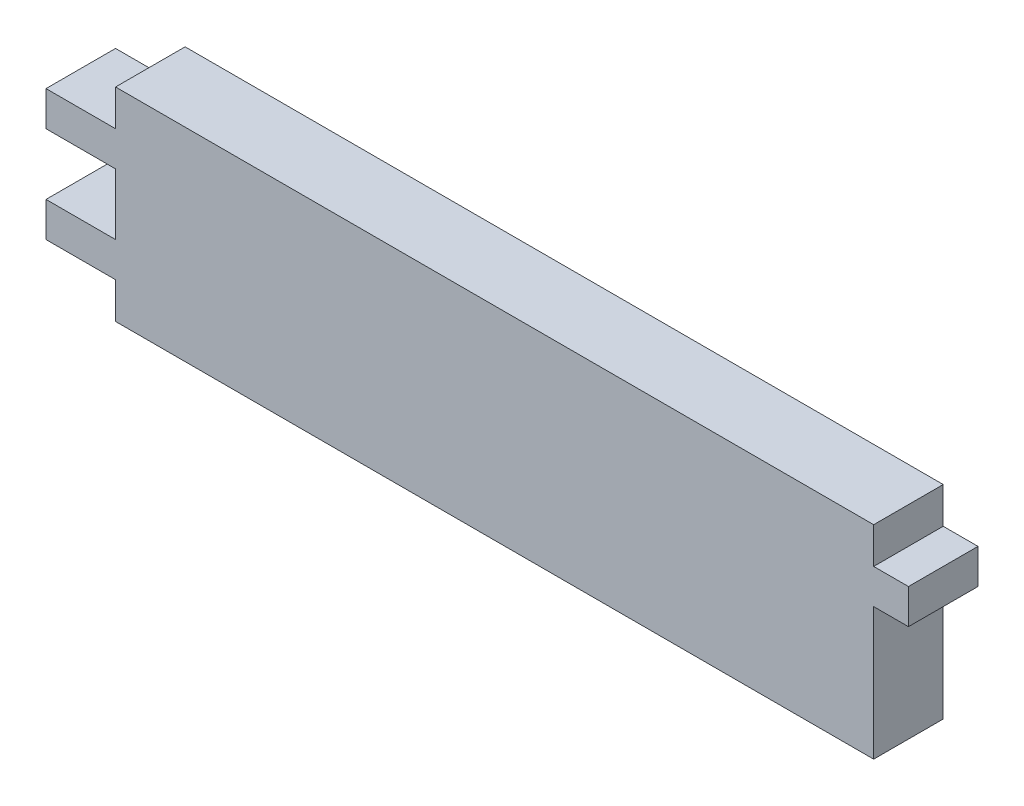
ISO-10303-21;
HEADER;
FILE_DESCRIPTION(('STEP AP214'),'2;1');
FILE_NAME('part.step','',(''),(''),'','','');
FILE_SCHEMA(('AUTOMOTIVE_DESIGN { 1 0 10303 214 1 1 1 1 }'));
ENDSEC;
DATA;
#1=APPLICATION_CONTEXT('core data for automotive mechanical design processes');
#2=APPLICATION_PROTOCOL_DEFINITION('international standard','automotive_design',2000,#1);
#3=PRODUCT_CONTEXT('',#1,'mechanical');
#4=PRODUCT('Part','Part','',(#3));
#5=PRODUCT_RELATED_PRODUCT_CATEGORY('part','',(#4));
#6=PRODUCT_DEFINITION_FORMATION('','',#4);
#7=PRODUCT_DEFINITION_CONTEXT('part definition',#1,'design');
#8=PRODUCT_DEFINITION('design','',#6,#7);
#9=PRODUCT_DEFINITION_SHAPE('','',#8);
#10=(LENGTH_UNIT() NAMED_UNIT(*) SI_UNIT(.MILLI.,.METRE.));
#11=(NAMED_UNIT(*) PLANE_ANGLE_UNIT() SI_UNIT($,.RADIAN.));
#12=(NAMED_UNIT(*) SI_UNIT($,.STERADIAN.) SOLID_ANGLE_UNIT());
#13=UNCERTAINTY_MEASURE_WITH_UNIT(LENGTH_MEASURE(1.E-05),#10,'distance_accuracy_value','');
#14=(GEOMETRIC_REPRESENTATION_CONTEXT(3) GLOBAL_UNCERTAINTY_ASSIGNED_CONTEXT((#13)) GLOBAL_UNIT_ASSIGNED_CONTEXT((#10,
#11,#12)) REPRESENTATION_CONTEXT('',''));
#15=CARTESIAN_POINT('',(0.,0.,0.));
#16=DIRECTION('',(0.,0.,1.));
#17=DIRECTION('',(1.,0.,0.));
#18=AXIS2_PLACEMENT_3D('',#15,#16,#17);
#19=CARTESIAN_POINT('',(-75.8403585971838,8.2416963886862,87.2437164679681));
#20=DIRECTION('',(1.,0.,0.));
#21=DIRECTION('',(0.,0.,-1.));
#22=AXIS2_PLACEMENT_3D('',#19,#20,#21);
#23=PLANE('',#22);
#24=DIRECTION('',(0.,-1.,0.));
#25=VECTOR('',#24,1.);
#26=CARTESIAN_POINT('',(-75.8403585971838,8.2416963886862,6.35000000000004));
#27=LINE('',#26,#25);
#28=CARTESIAN_POINT('',(-75.8403585971838,8.2416963886862,6.35000000000004));
#29=VERTEX_POINT('',#28);
#30=CARTESIAN_POINT('',(-75.8403585971838,5.0666963886862,6.35000000000004));
#31=VERTEX_POINT('',#30);
#32=EDGE_CURVE('E203',#29,#31,#27,.T.);
#33=ORIENTED_EDGE('',*,*,#32,.F.);
#34=DIRECTION('',(0.,0.,-1.));
#35=VECTOR('',#34,1.);
#36=CARTESIAN_POINT('',(-75.8403585971838,8.2416963886862,87.2437164679681));
#37=LINE('',#36,#35);
#38=CARTESIAN_POINT('',(-75.8403585971838,8.2416963886862,0.));
#39=VERTEX_POINT('',#38);
#40=EDGE_CURVE('E36',#29,#39,#37,.T.);
#41=ORIENTED_EDGE('',*,*,#40,.T.);
#42=DIRECTION('',(0.,-1.,0.));
#43=VECTOR('',#42,1.);
#44=CARTESIAN_POINT('',(-75.8403585971838,8.2416963886862,0.));
#45=LINE('',#44,#43);
#46=CARTESIAN_POINT('',(-75.8403585971838,5.0666963886862,0.));
#47=VERTEX_POINT('',#46);
#48=EDGE_CURVE('E211',#39,#47,#45,.T.);
#49=ORIENTED_EDGE('',*,*,#48,.T.);
#50=DIRECTION('',(0.,0.,-1.));
#51=VECTOR('',#50,1.);
#52=CARTESIAN_POINT('',(-75.8403585971838,5.0666963886862,87.2437164679681));
#53=LINE('',#52,#51);
#54=EDGE_CURVE('E119',#31,#47,#53,.T.);
#55=ORIENTED_EDGE('',*,*,#54,.F.);
#56=EDGE_LOOP('',(#33,#41,#49,#55));
#57=FACE_BOUND('',#56,.T.);
#58=ADVANCED_FACE('F32',(#57),#23,.F.);
#59=CARTESIAN_POINT('',(-75.8403585971838,5.0666963886862,87.2437164679681));
#60=DIRECTION('',(0.,1.,0.));
#61=DIRECTION('',(0.,0.,1.));
#62=AXIS2_PLACEMENT_3D('',#59,#60,#61);
#63=PLANE('',#62);
#64=DIRECTION('',(1.,0.,0.));
#65=VECTOR('',#64,1.);
#66=CARTESIAN_POINT('',(-75.8403585971838,5.0666963886862,6.35000000000004));
#67=LINE('',#66,#65);
#68=CARTESIAN_POINT('',(-69.4903585971838,5.0666963886862,6.35000000000004));
#69=VERTEX_POINT('',#68);
#70=EDGE_CURVE('E126',#31,#69,#67,.T.);
#71=ORIENTED_EDGE('',*,*,#70,.F.);
#72=ORIENTED_EDGE('',*,*,#54,.T.);
#73=DIRECTION('',(1.,0.,0.));
#74=VECTOR('',#73,1.);
#75=CARTESIAN_POINT('',(-75.8403585971838,5.0666963886862,0.));
#76=LINE('',#75,#74);
#77=CARTESIAN_POINT('',(-69.4903585971838,5.0666963886862,0.));
#78=VERTEX_POINT('',#77);
#79=EDGE_CURVE('E210',#47,#78,#76,.T.);
#80=ORIENTED_EDGE('',*,*,#79,.T.);
#81=DIRECTION('',(0.,0.,-1.));
#82=VECTOR('',#81,1.);
#83=CARTESIAN_POINT('',(-69.4903585971838,5.0666963886862,87.2437164679681));
#84=LINE('',#83,#82);
#85=EDGE_CURVE('E212',#69,#78,#84,.T.);
#86=ORIENTED_EDGE('',*,*,#85,.F.);
#87=EDGE_LOOP('',(#71,#72,#80,#86));
#88=FACE_BOUND('',#87,.T.);
#89=ADVANCED_FACE('F281',(#88),#63,.F.);
#90=CARTESIAN_POINT('',(-69.4903585971838,5.0666963886862,87.2437164679681));
#91=DIRECTION('',(1.,0.,0.));
#92=DIRECTION('',(0.,0.,-1.));
#93=AXIS2_PLACEMENT_3D('',#90,#91,#92);
#94=PLANE('',#93);
#95=DIRECTION('',(0.,-1.,0.));
#96=VECTOR('',#95,1.);
#97=CARTESIAN_POINT('',(-69.4903585971838,5.0666963886862,6.35000000000004));
#98=LINE('',#97,#96);
#99=CARTESIAN_POINT('',(-69.4903585971838,-0.521303611313801,6.35000000000004));
#100=VERTEX_POINT('',#99);
#101=EDGE_CURVE('E199',#69,#100,#98,.T.);
#102=ORIENTED_EDGE('',*,*,#101,.F.);
#103=ORIENTED_EDGE('',*,*,#85,.T.);
#104=DIRECTION('',(0.,-1.,0.));
#105=VECTOR('',#104,1.);
#106=CARTESIAN_POINT('',(-69.4903585971838,5.0666963886862,0.));
#107=LINE('',#106,#105);
#108=CARTESIAN_POINT('',(-69.4903585971838,-0.521303611313801,0.));
#109=VERTEX_POINT('',#108);
#110=EDGE_CURVE('E214',#78,#109,#107,.T.);
#111=ORIENTED_EDGE('',*,*,#110,.T.);
#112=DIRECTION('',(0.,0.,-1.));
#113=VECTOR('',#112,1.);
#114=CARTESIAN_POINT('',(-69.4903585971838,-0.521303611313801,87.2437164679681));
#115=LINE('',#114,#113);
#116=EDGE_CURVE('E215',#100,#109,#115,.T.);
#117=ORIENTED_EDGE('',*,*,#116,.F.);
#118=EDGE_LOOP('',(#102,#103,#111,#117));
#119=FACE_BOUND('',#118,.T.);
#120=ADVANCED_FACE('F284',(#119),#94,.F.);
#121=CARTESIAN_POINT('',(-69.4903585971838,-0.521303611313801,87.2437164679681));
#122=DIRECTION('',(0.,-1.,0.));
#123=DIRECTION('',(1.,0.,0.));
#124=AXIS2_PLACEMENT_3D('',#121,#122,#123);
#125=PLANE('',#124);
#126=DIRECTION('',(-1.,0.,0.));
#127=VECTOR('',#126,1.);
#128=CARTESIAN_POINT('',(-69.4903585971838,-0.521303611313801,6.35000000000004));
#129=LINE('',#128,#127);
#130=CARTESIAN_POINT('',(-75.8403585971838,-0.521303611313801,6.35000000000004));
#131=VERTEX_POINT('',#130);
#132=EDGE_CURVE('E196',#100,#131,#129,.T.);
#133=ORIENTED_EDGE('',*,*,#132,.F.);
#134=ORIENTED_EDGE('',*,*,#116,.T.);
#135=DIRECTION('',(-1.,0.,0.));
#136=VECTOR('',#135,1.);
#137=CARTESIAN_POINT('',(-69.4903585971838,-0.521303611313801,0.));
#138=LINE('',#137,#136);
#139=CARTESIAN_POINT('',(-75.8403585971838,-0.521303611313801,0.));
#140=VERTEX_POINT('',#139);
#141=EDGE_CURVE('E217',#109,#140,#138,.T.);
#142=ORIENTED_EDGE('',*,*,#141,.T.);
#143=DIRECTION('',(0.,0.,-1.));
#144=VECTOR('',#143,1.);
#145=CARTESIAN_POINT('',(-75.8403585971838,-0.521303611313801,87.2437164679681));
#146=LINE('',#145,#144);
#147=EDGE_CURVE('E218',#131,#140,#146,.T.);
#148=ORIENTED_EDGE('',*,*,#147,.F.);
#149=EDGE_LOOP('',(#133,#134,#142,#148));
#150=FACE_BOUND('',#149,.T.);
#151=ADVANCED_FACE('F286',(#150),#125,.F.);
#152=CARTESIAN_POINT('',(-75.8403585971838,-0.521303611313801,87.2437164679681));
#153=DIRECTION('',(1.,0.,0.));
#154=DIRECTION('',(0.,0.,-1.));
#155=AXIS2_PLACEMENT_3D('',#152,#153,#154);
#156=PLANE('',#155);
#157=DIRECTION('',(0.,-1.,0.));
#158=VECTOR('',#157,1.);
#159=CARTESIAN_POINT('',(-75.8403585971838,-0.521303611313801,6.35000000000004));
#160=LINE('',#159,#158);
#161=CARTESIAN_POINT('',(-75.8403585971838,-3.6963036113138,6.35000000000004));
#162=VERTEX_POINT('',#161);
#163=EDGE_CURVE('E193',#131,#162,#160,.T.);
#164=ORIENTED_EDGE('',*,*,#163,.F.);
#165=ORIENTED_EDGE('',*,*,#147,.T.);
#166=DIRECTION('',(0.,-1.,0.));
#167=VECTOR('',#166,1.);
#168=CARTESIAN_POINT('',(-75.8403585971838,-0.521303611313801,0.));
#169=LINE('',#168,#167);
#170=CARTESIAN_POINT('',(-75.8403585971838,-3.6963036113138,0.));
#171=VERTEX_POINT('',#170);
#172=EDGE_CURVE('E220',#140,#171,#169,.T.);
#173=ORIENTED_EDGE('',*,*,#172,.T.);
#174=DIRECTION('',(0.,0.,-1.));
#175=VECTOR('',#174,1.);
#176=CARTESIAN_POINT('',(-75.8403585971838,-3.6963036113138,87.2437164679681));
#177=LINE('',#176,#175);
#178=EDGE_CURVE('E221',#162,#171,#177,.T.);
#179=ORIENTED_EDGE('',*,*,#178,.F.);
#180=EDGE_LOOP('',(#164,#165,#173,#179));
#181=FACE_BOUND('',#180,.T.);
#182=ADVANCED_FACE('F290',(#181),#156,.F.);
#183=CARTESIAN_POINT('',(-75.8403585971838,-3.6963036113138,87.2437164679681));
#184=DIRECTION('',(0.,1.,0.));
#185=DIRECTION('',(-1.,0.,0.));
#186=AXIS2_PLACEMENT_3D('',#183,#184,#185);
#187=PLANE('',#186);
#188=DIRECTION('',(1.,0.,0.));
#189=VECTOR('',#188,1.);
#190=CARTESIAN_POINT('',(-75.8403585971838,-3.6963036113138,6.35000000000004));
#191=LINE('',#190,#189);
#192=CARTESIAN_POINT('',(-69.4903585971838,-3.6963036113138,6.35000000000004));
#193=VERTEX_POINT('',#192);
#194=EDGE_CURVE('E190',#162,#193,#191,.T.);
#195=ORIENTED_EDGE('',*,*,#194,.F.);
#196=ORIENTED_EDGE('',*,*,#178,.T.);
#197=DIRECTION('',(1.,0.,0.));
#198=VECTOR('',#197,1.);
#199=CARTESIAN_POINT('',(-75.8403585971838,-3.6963036113138,0.));
#200=LINE('',#199,#198);
#201=CARTESIAN_POINT('',(-69.4903585971838,-3.6963036113138,0.));
#202=VERTEX_POINT('',#201);
#203=EDGE_CURVE('E223',#171,#202,#200,.T.);
#204=ORIENTED_EDGE('',*,*,#203,.T.);
#205=DIRECTION('',(0.,0.,-1.));
#206=VECTOR('',#205,1.);
#207=CARTESIAN_POINT('',(-69.4903585971838,-3.6963036113138,87.2437164679681));
#208=LINE('',#207,#206);
#209=EDGE_CURVE('E224',#193,#202,#208,.T.);
#210=ORIENTED_EDGE('',*,*,#209,.F.);
#211=EDGE_LOOP('',(#195,#196,#204,#210));
#212=FACE_BOUND('',#211,.T.);
#213=ADVANCED_FACE('F295',(#212),#187,.F.);
#214=CARTESIAN_POINT('',(-69.4903585971838,-6.9983036113138,87.2437164679681));
#215=DIRECTION('',(1.,0.,0.));
#216=DIRECTION('',(0.,0.,-1.));
#217=AXIS2_PLACEMENT_3D('',#214,#215,#216);
#218=PLANE('',#217);
#219=DIRECTION('',(0.,-1.,0.));
#220=VECTOR('',#219,1.);
#221=CARTESIAN_POINT('',(-69.4903585971838,-6.9983036113138,6.35000000000004));
#222=LINE('',#221,#220);
#223=CARTESIAN_POINT('',(-69.4903585971838,-6.9983036113138,6.35000000000004));
#224=VERTEX_POINT('',#223);
#225=EDGE_CURVE('E187',#193,#224,#222,.T.);
#226=ORIENTED_EDGE('',*,*,#225,.F.);
#227=ORIENTED_EDGE('',*,*,#209,.T.);
#228=DIRECTION('',(0.,-1.,0.));
#229=VECTOR('',#228,1.);
#230=CARTESIAN_POINT('',(-69.4903585971838,-6.9983036113138,0.));
#231=LINE('',#230,#229);
#232=CARTESIAN_POINT('',(-69.4903585971838,-6.9983036113138,0.));
#233=VERTEX_POINT('',#232);
#234=EDGE_CURVE('E226',#202,#233,#231,.T.);
#235=ORIENTED_EDGE('',*,*,#234,.T.);
#236=DIRECTION('',(0.,0.,-1.));
#237=VECTOR('',#236,1.);
#238=CARTESIAN_POINT('',(-69.4903585971838,-6.9983036113138,87.2437164679681));
#239=LINE('',#238,#237);
#240=EDGE_CURVE('E227',#224,#233,#239,.T.);
#241=ORIENTED_EDGE('',*,*,#240,.F.);
#242=EDGE_LOOP('',(#226,#227,#235,#241));
#243=FACE_BOUND('',#242,.T.);
#244=ADVANCED_FACE('F298',(#243),#218,.F.);
#245=CARTESIAN_POINT('',(-69.4903585971838,-6.9983036113138,87.2437164679681));
#246=DIRECTION('',(0.,1.,0.));
#247=DIRECTION('',(0.,0.,1.));
#248=AXIS2_PLACEMENT_3D('',#245,#246,#247);
#249=PLANE('',#248);
#250=DIRECTION('',(1.,0.,0.));
#251=VECTOR('',#250,1.);
#252=CARTESIAN_POINT('',(-69.4903585971838,-6.9983036113138,6.35000000000004));
#253=LINE('',#252,#251);
#254=CARTESIAN_POINT('',(-0.27535859718375,-6.9983036113138,6.35000000000004));
#255=VERTEX_POINT('',#254);
#256=EDGE_CURVE('E184',#224,#255,#253,.T.);
#257=ORIENTED_EDGE('',*,*,#256,.F.);
#258=ORIENTED_EDGE('',*,*,#240,.T.);
#259=DIRECTION('',(1.,0.,0.));
#260=VECTOR('',#259,1.);
#261=CARTESIAN_POINT('',(-69.4903585971838,-6.9983036113138,0.));
#262=LINE('',#261,#260);
#263=CARTESIAN_POINT('',(-0.27535859718375,-6.9983036113138,0.));
#264=VERTEX_POINT('',#263);
#265=EDGE_CURVE('E229',#233,#264,#262,.T.);
#266=ORIENTED_EDGE('',*,*,#265,.T.);
#267=DIRECTION('',(0.,0.,-1.));
#268=VECTOR('',#267,1.);
#269=CARTESIAN_POINT('',(-0.27535859718375,-6.9983036113138,87.2437164679681));
#270=LINE('',#269,#268);
#271=EDGE_CURVE('E230',#255,#264,#270,.T.);
#272=ORIENTED_EDGE('',*,*,#271,.F.);
#273=EDGE_LOOP('',(#257,#258,#266,#272));
#274=FACE_BOUND('',#273,.T.);
#275=ADVANCED_FACE('F302',(#274),#249,.F.);
#276=CARTESIAN_POINT('',(-0.27535859718375,5.06669638868619,87.2437164679681));
#277=DIRECTION('',(-1.,0.,0.));
#278=DIRECTION('',(0.,0.,1.));
#279=AXIS2_PLACEMENT_3D('',#276,#277,#278);
#280=PLANE('',#279);
#281=DIRECTION('',(0.,1.,0.));
#282=VECTOR('',#281,1.);
#283=CARTESIAN_POINT('',(-0.27535859718375,5.06669638868619,6.35000000000004));
#284=LINE('',#283,#282);
#285=CARTESIAN_POINT('',(-0.27535859718375,5.06669638868619,6.35000000000004));
#286=VERTEX_POINT('',#285);
#287=EDGE_CURVE('E181',#255,#286,#284,.T.);
#288=ORIENTED_EDGE('',*,*,#287,.F.);
#289=ORIENTED_EDGE('',*,*,#271,.T.);
#290=DIRECTION('',(0.,1.,0.));
#291=VECTOR('',#290,1.);
#292=CARTESIAN_POINT('',(-0.27535859718375,5.06669638868619,0.));
#293=LINE('',#292,#291);
#294=CARTESIAN_POINT('',(-0.27535859718375,5.06669638868619,0.));
#295=VERTEX_POINT('',#294);
#296=EDGE_CURVE('E232',#264,#295,#293,.T.);
#297=ORIENTED_EDGE('',*,*,#296,.T.);
#298=DIRECTION('',(0.,0.,-1.));
#299=VECTOR('',#298,1.);
#300=CARTESIAN_POINT('',(-0.27535859718375,5.06669638868619,87.2437164679681));
#301=LINE('',#300,#299);
#302=EDGE_CURVE('E233',#286,#295,#301,.T.);
#303=ORIENTED_EDGE('',*,*,#302,.F.);
#304=EDGE_LOOP('',(#288,#289,#297,#303));
#305=FACE_BOUND('',#304,.T.);
#306=ADVANCED_FACE('F307',(#305),#280,.F.);
#307=CARTESIAN_POINT('',(-0.27535859718375,5.06669638868619,87.2437164679681));
#308=DIRECTION('',(0.,1.,0.));
#309=DIRECTION('',(0.,0.,1.));
#310=AXIS2_PLACEMENT_3D('',#307,#308,#309);
#311=PLANE('',#310);
#312=DIRECTION('',(1.,0.,0.));
#313=VECTOR('',#312,1.);
#314=CARTESIAN_POINT('',(-0.27535859718375,5.06669638868619,6.35000000000004));
#315=LINE('',#314,#313);
#316=CARTESIAN_POINT('',(2.89964140281629,5.06669638868619,6.35000000000004));
#317=VERTEX_POINT('',#316);
#318=EDGE_CURVE('E178',#286,#317,#315,.T.);
#319=ORIENTED_EDGE('',*,*,#318,.F.);
#320=ORIENTED_EDGE('',*,*,#302,.T.);
#321=DIRECTION('',(1.,0.,0.));
#322=VECTOR('',#321,1.);
#323=CARTESIAN_POINT('',(-0.27535859718375,5.06669638868619,0.));
#324=LINE('',#323,#322);
#325=CARTESIAN_POINT('',(2.89964140281629,5.06669638868619,0.));
#326=VERTEX_POINT('',#325);
#327=EDGE_CURVE('E235',#295,#326,#324,.T.);
#328=ORIENTED_EDGE('',*,*,#327,.T.);
#329=DIRECTION('',(0.,0.,-1.));
#330=VECTOR('',#329,1.);
#331=CARTESIAN_POINT('',(2.89964140281629,5.06669638868619,87.2437164679681));
#332=LINE('',#331,#330);
#333=EDGE_CURVE('E236',#317,#326,#332,.T.);
#334=ORIENTED_EDGE('',*,*,#333,.F.);
#335=EDGE_LOOP('',(#319,#320,#328,#334));
#336=FACE_BOUND('',#335,.T.);
#337=ADVANCED_FACE('F310',(#336),#311,.F.);
#338=CARTESIAN_POINT('',(2.89964140281629,5.06669638868619,87.2437164679681));
#339=DIRECTION('',(-1.,0.,0.));
#340=DIRECTION('',(0.,0.,1.));
#341=AXIS2_PLACEMENT_3D('',#338,#339,#340);
#342=PLANE('',#341);
#343=DIRECTION('',(0.,1.,0.));
#344=VECTOR('',#343,1.);
#345=CARTESIAN_POINT('',(2.89964140281629,5.06669638868619,6.35000000000004));
#346=LINE('',#345,#344);
#347=CARTESIAN_POINT('',(2.89964140281629,8.24169638868618,6.35000000000004));
#348=VERTEX_POINT('',#347);
#349=EDGE_CURVE('E175',#317,#348,#346,.T.);
#350=ORIENTED_EDGE('',*,*,#349,.F.);
#351=ORIENTED_EDGE('',*,*,#333,.T.);
#352=DIRECTION('',(0.,1.,0.));
#353=VECTOR('',#352,1.);
#354=CARTESIAN_POINT('',(2.89964140281629,5.06669638868619,0.));
#355=LINE('',#354,#353);
#356=CARTESIAN_POINT('',(2.89964140281629,8.24169638868618,0.));
#357=VERTEX_POINT('',#356);
#358=EDGE_CURVE('E238',#326,#357,#355,.T.);
#359=ORIENTED_EDGE('',*,*,#358,.T.);
#360=DIRECTION('',(0.,0.,-1.));
#361=VECTOR('',#360,1.);
#362=CARTESIAN_POINT('',(2.89964140281629,8.24169638868618,87.2437164679681));
#363=LINE('',#362,#361);
#364=EDGE_CURVE('E239',#348,#357,#363,.T.);
#365=ORIENTED_EDGE('',*,*,#364,.F.);
#366=EDGE_LOOP('',(#350,#351,#359,#365));
#367=FACE_BOUND('',#366,.T.);
#368=ADVANCED_FACE('F314',(#367),#342,.F.);
#369=CARTESIAN_POINT('',(2.89964140281629,8.24169638868618,87.2437164679681));
#370=DIRECTION('',(0.,-1.,0.));
#371=DIRECTION('',(0.,0.,-1.));
#372=AXIS2_PLACEMENT_3D('',#369,#370,#371);
#373=PLANE('',#372);
#374=DIRECTION('',(-1.,0.,0.));
#375=VECTOR('',#374,1.);
#376=CARTESIAN_POINT('',(2.89964140281629,8.24169638868618,6.35000000000004));
#377=LINE('',#376,#375);
#378=CARTESIAN_POINT('',(-0.27535859718375,8.24169638868618,6.35000000000004));
#379=VERTEX_POINT('',#378);
#380=EDGE_CURVE('E170',#348,#379,#377,.T.);
#381=ORIENTED_EDGE('',*,*,#380,.F.);
#382=ORIENTED_EDGE('',*,*,#364,.T.);
#383=DIRECTION('',(-1.,0.,0.));
#384=VECTOR('',#383,1.);
#385=CARTESIAN_POINT('',(2.89964140281629,8.24169638868618,0.));
#386=LINE('',#385,#384);
#387=CARTESIAN_POINT('',(-0.27535859718375,8.24169638868618,0.));
#388=VERTEX_POINT('',#387);
#389=EDGE_CURVE('E241',#357,#388,#386,.T.);
#390=ORIENTED_EDGE('',*,*,#389,.T.);
#391=DIRECTION('',(0.,0.,-1.));
#392=VECTOR('',#391,1.);
#393=CARTESIAN_POINT('',(-0.27535859718375,8.24169638868618,87.2437164679681));
#394=LINE('',#393,#392);
#395=EDGE_CURVE('E242',#379,#388,#394,.T.);
#396=ORIENTED_EDGE('',*,*,#395,.F.);
#397=EDGE_LOOP('',(#381,#382,#390,#396));
#398=FACE_BOUND('',#397,.T.);
#399=ADVANCED_FACE('F319',(#398),#373,.F.);
#400=CARTESIAN_POINT('',(-0.27535859718375,8.24169638868618,87.2437164679681));
#401=DIRECTION('',(-1.,0.,0.));
#402=DIRECTION('',(0.,0.,1.));
#403=AXIS2_PLACEMENT_3D('',#400,#401,#402);
#404=PLANE('',#403);
#405=DIRECTION('',(0.,1.,0.));
#406=VECTOR('',#405,1.);
#407=CARTESIAN_POINT('',(-0.27535859718375,8.24169638868618,6.35000000000004));
#408=LINE('',#407,#406);
#409=CARTESIAN_POINT('',(-0.27535859718375,11.5436963886862,6.35000000000004));
#410=VERTEX_POINT('',#409);
#411=EDGE_CURVE('E168',#379,#410,#408,.T.);
#412=ORIENTED_EDGE('',*,*,#411,.F.);
#413=ORIENTED_EDGE('',*,*,#395,.T.);
#414=DIRECTION('',(0.,1.,0.));
#415=VECTOR('',#414,1.);
#416=CARTESIAN_POINT('',(-0.27535859718375,8.24169638868618,0.));
#417=LINE('',#416,#415);
#418=CARTESIAN_POINT('',(-0.27535859718375,11.5436963886862,0.));
#419=VERTEX_POINT('',#418);
#420=EDGE_CURVE('E244',#388,#419,#417,.T.);
#421=ORIENTED_EDGE('',*,*,#420,.T.);
#422=DIRECTION('',(0.,0.,-1.));
#423=VECTOR('',#422,1.);
#424=CARTESIAN_POINT('',(-0.27535859718375,11.5436963886862,87.2437164679681));
#425=LINE('',#424,#423);
#426=EDGE_CURVE('E245',#410,#419,#425,.T.);
#427=ORIENTED_EDGE('',*,*,#426,.F.);
#428=EDGE_LOOP('',(#412,#413,#421,#427));
#429=FACE_BOUND('',#428,.T.);
#430=ADVANCED_FACE('F322',(#429),#404,.F.);
#431=CARTESIAN_POINT('',(-0.27535859718375,11.5436963886862,87.2437164679681));
#432=DIRECTION('',(0.,-1.,0.));
#433=DIRECTION('',(0.,0.,-1.));
#434=AXIS2_PLACEMENT_3D('',#431,#432,#433);
#435=PLANE('',#434);
#436=DIRECTION('',(-1.,0.,0.));
#437=VECTOR('',#436,1.);
#438=CARTESIAN_POINT('',(-0.27535859718375,11.5436963886862,6.35000000000004));
#439=LINE('',#438,#437);
#440=CARTESIAN_POINT('',(-69.4903585971838,11.5436963886862,6.35000000000004));
#441=VERTEX_POINT('',#440);
#442=EDGE_CURVE('E41',#410,#441,#439,.T.);
#443=ORIENTED_EDGE('',*,*,#442,.F.);
#444=ORIENTED_EDGE('',*,*,#426,.T.);
#445=DIRECTION('',(-1.,0.,0.));
#446=VECTOR('',#445,1.);
#447=CARTESIAN_POINT('',(-0.27535859718375,11.5436963886862,0.));
#448=LINE('',#447,#446);
#449=CARTESIAN_POINT('',(-69.4903585971838,11.5436963886862,0.));
#450=VERTEX_POINT('',#449);
#451=EDGE_CURVE('E162',#419,#450,#448,.T.);
#452=ORIENTED_EDGE('',*,*,#451,.T.);
#453=DIRECTION('',(0.,0.,-1.));
#454=VECTOR('',#453,1.);
#455=CARTESIAN_POINT('',(-69.4903585971838,11.5436963886862,87.2437164679681));
#456=LINE('',#455,#454);
#457=EDGE_CURVE('E153',#441,#450,#456,.T.);
#458=ORIENTED_EDGE('',*,*,#457,.F.);
#459=EDGE_LOOP('',(#443,#444,#452,#458));
#460=FACE_BOUND('',#459,.T.);
#461=ADVANCED_FACE('F159',(#460),#435,.F.);
#462=CARTESIAN_POINT('',(-69.4903585971838,8.2416963886862,87.2437164679681));
#463=DIRECTION('',(1.,0.,0.));
#464=DIRECTION('',(0.,0.,-1.));
#465=AXIS2_PLACEMENT_3D('',#462,#463,#464);
#466=PLANE('',#465);
#467=DIRECTION('',(0.,-1.,0.));
#468=VECTOR('',#467,1.);
#469=CARTESIAN_POINT('',(-69.4903585971838,8.2416963886862,6.35000000000004));
#470=LINE('',#469,#468);
#471=CARTESIAN_POINT('',(-69.4903585971838,8.2416963886862,6.35000000000004));
#472=VERTEX_POINT('',#471);
#473=EDGE_CURVE('E11',#441,#472,#470,.T.);
#474=ORIENTED_EDGE('',*,*,#473,.F.);
#475=ORIENTED_EDGE('',*,*,#457,.T.);
#476=DIRECTION('',(0.,-1.,0.));
#477=VECTOR('',#476,1.);
#478=CARTESIAN_POINT('',(-69.4903585971838,8.2416963886862,0.));
#479=LINE('',#478,#477);
#480=CARTESIAN_POINT('',(-69.4903585971838,8.2416963886862,0.));
#481=VERTEX_POINT('',#480);
#482=EDGE_CURVE('E164',#450,#481,#479,.T.);
#483=ORIENTED_EDGE('',*,*,#482,.T.);
#484=DIRECTION('',(0.,0.,-1.));
#485=VECTOR('',#484,1.);
#486=CARTESIAN_POINT('',(-69.4903585971838,8.2416963886862,87.2437164679681));
#487=LINE('',#486,#485);
#488=EDGE_CURVE('E54',#472,#481,#487,.T.);
#489=ORIENTED_EDGE('',*,*,#488,.F.);
#490=EDGE_LOOP('',(#474,#475,#483,#489));
#491=FACE_BOUND('',#490,.T.);
#492=ADVANCED_FACE('F152',(#491),#466,.F.);
#493=CARTESIAN_POINT('',(-75.8403585971838,8.2416963886862,87.2437164679681));
#494=DIRECTION('',(0.,-1.,0.));
#495=DIRECTION('',(0.,0.,-1.));
#496=AXIS2_PLACEMENT_3D('',#493,#494,#495);
#497=PLANE('',#496);
#498=DIRECTION('',(-1.,0.,0.));
#499=VECTOR('',#498,1.);
#500=CARTESIAN_POINT('',(-75.8403585971838,8.2416963886862,6.35000000000004));
#501=LINE('',#500,#499);
#502=EDGE_CURVE('E206',#472,#29,#501,.T.);
#503=ORIENTED_EDGE('',*,*,#502,.F.);
#504=ORIENTED_EDGE('',*,*,#488,.T.);
#505=DIRECTION('',(-1.,0.,0.));
#506=VECTOR('',#505,1.);
#507=CARTESIAN_POINT('',(-75.8403585971838,8.2416963886862,0.));
#508=LINE('',#507,#506);
#509=EDGE_CURVE('E208',#481,#39,#508,.T.);
#510=ORIENTED_EDGE('',*,*,#509,.T.);
#511=ORIENTED_EDGE('',*,*,#40,.F.);
#512=EDGE_LOOP('',(#503,#504,#510,#511));
#513=FACE_BOUND('',#512,.T.);
#514=ADVANCED_FACE('F276',(#513),#497,.F.);
#515=CARTESIAN_POINT('',(0.,0.,0.));
#516=DIRECTION('',(0.,0.,1.));
#517=DIRECTION('',(1.,0.,0.));
#518=AXIS2_PLACEMENT_3D('',#515,#516,#517);
#519=PLANE('',#518);
#520=ORIENTED_EDGE('',*,*,#48,.F.);
#521=ORIENTED_EDGE('',*,*,#509,.F.);
#522=ORIENTED_EDGE('',*,*,#482,.F.);
#523=ORIENTED_EDGE('',*,*,#451,.F.);
#524=ORIENTED_EDGE('',*,*,#420,.F.);
#525=ORIENTED_EDGE('',*,*,#389,.F.);
#526=ORIENTED_EDGE('',*,*,#358,.F.);
#527=ORIENTED_EDGE('',*,*,#327,.F.);
#528=ORIENTED_EDGE('',*,*,#296,.F.);
#529=ORIENTED_EDGE('',*,*,#265,.F.);
#530=ORIENTED_EDGE('',*,*,#234,.F.);
#531=ORIENTED_EDGE('',*,*,#203,.F.);
#532=ORIENTED_EDGE('',*,*,#172,.F.);
#533=ORIENTED_EDGE('',*,*,#141,.F.);
#534=ORIENTED_EDGE('',*,*,#110,.F.);
#535=ORIENTED_EDGE('',*,*,#79,.F.);
#536=EDGE_LOOP('',(#520,#521,#522,#523,#524,#525,#526,#527,#528,#529,#530,#531,#532,#533,#534,#535));
#537=FACE_BOUND('',#536,.T.);
#538=ADVANCED_FACE('F278',(#537),#519,.F.);
#539=CARTESIAN_POINT('',(305.282450244832,5.06669638868619,6.35000000000004));
#540=DIRECTION('',(0.,0.,1.));
#541=DIRECTION('',(1.,0.,0.));
#542=AXIS2_PLACEMENT_3D('',#539,#540,#541);
#543=PLANE('',#542);
#544=ORIENTED_EDGE('',*,*,#502,.T.);
#545=ORIENTED_EDGE('',*,*,#32,.T.);
#546=ORIENTED_EDGE('',*,*,#70,.T.);
#547=ORIENTED_EDGE('',*,*,#101,.T.);
#548=ORIENTED_EDGE('',*,*,#132,.T.);
#549=ORIENTED_EDGE('',*,*,#163,.T.);
#550=ORIENTED_EDGE('',*,*,#194,.T.);
#551=ORIENTED_EDGE('',*,*,#225,.T.);
#552=ORIENTED_EDGE('',*,*,#256,.T.);
#553=ORIENTED_EDGE('',*,*,#287,.T.);
#554=ORIENTED_EDGE('',*,*,#318,.T.);
#555=ORIENTED_EDGE('',*,*,#349,.T.);
#556=ORIENTED_EDGE('',*,*,#380,.T.);
#557=ORIENTED_EDGE('',*,*,#411,.T.);
#558=ORIENTED_EDGE('',*,*,#442,.T.);
#559=ORIENTED_EDGE('',*,*,#473,.T.);
#560=EDGE_LOOP('',(#544,#545,#546,#547,#548,#549,#550,#551,#552,#553,#554,#555,#556,#557,#558,#559));
#561=FACE_BOUND('',#560,.T.);
#562=ADVANCED_FACE('F34',(#561),#543,.T.);
#563=CLOSED_SHELL('',(#58,#89,#120,#151,#182,#213,#244,#275,#306,#337,#368,#399,#430,#461,#492,
#514,#538,#562));
#564=MANIFOLD_SOLID_BREP('B2',#563);
#565=ADVANCED_BREP_SHAPE_REPRESENTATION('',(#18,#564),#14);
#566=SHAPE_DEFINITION_REPRESENTATION(#9,#565);
ENDSEC;
END-ISO-10303-21;
